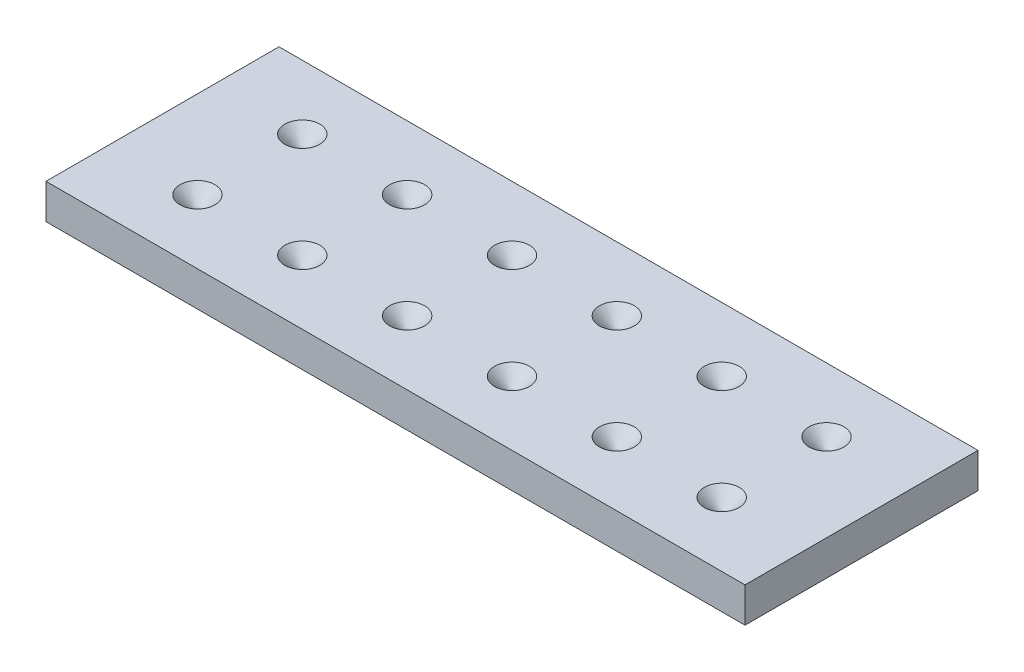
ISO-10303-21;
HEADER;
FILE_DESCRIPTION(('STEP AP214'),'2;1');
FILE_NAME('part.step','',(''),(''),'','','');
FILE_SCHEMA(('AUTOMOTIVE_DESIGN { 1 0 10303 214 1 1 1 1 }'));
ENDSEC;
DATA;
#1=APPLICATION_CONTEXT('core data for automotive mechanical design processes');
#2=APPLICATION_PROTOCOL_DEFINITION('international standard','automotive_design',2000,#1);
#3=PRODUCT_CONTEXT('',#1,'mechanical');
#4=PRODUCT('Part','Part','',(#3));
#5=PRODUCT_RELATED_PRODUCT_CATEGORY('part','',(#4));
#6=PRODUCT_DEFINITION_FORMATION('','',#4);
#7=PRODUCT_DEFINITION_CONTEXT('part definition',#1,'design');
#8=PRODUCT_DEFINITION('design','',#6,#7);
#9=PRODUCT_DEFINITION_SHAPE('','',#8);
#10=(LENGTH_UNIT() NAMED_UNIT(*) SI_UNIT(.MILLI.,.METRE.));
#11=(NAMED_UNIT(*) PLANE_ANGLE_UNIT() SI_UNIT($,.RADIAN.));
#12=(NAMED_UNIT(*) SI_UNIT($,.STERADIAN.) SOLID_ANGLE_UNIT());
#13=UNCERTAINTY_MEASURE_WITH_UNIT(LENGTH_MEASURE(1.E-05),#10,'distance_accuracy_value','');
#14=(GEOMETRIC_REPRESENTATION_CONTEXT(3) GLOBAL_UNCERTAINTY_ASSIGNED_CONTEXT((#13)) GLOBAL_UNIT_ASSIGNED_CONTEXT((#10,
#11,#12)) REPRESENTATION_CONTEXT('',''));
#15=CARTESIAN_POINT('',(0.,0.,0.));
#16=DIRECTION('',(0.,0.,1.));
#17=DIRECTION('',(1.,0.,0.));
#18=AXIS2_PLACEMENT_3D('',#15,#16,#17);
#19=CARTESIAN_POINT('',(22.5,3.,-4.5));
#20=DIRECTION('',(0.,1.,0.));
#21=DIRECTION('',(0.,0.,1.));
#22=AXIS2_PLACEMENT_3D('',#19,#20,#21);
#23=CONICAL_SURFACE('',#22,1.5,0.78539816339745);
#24=CARTESIAN_POINT('',(22.5,1.5,-4.5));
#25=VERTEX_POINT('',#24);
#26=VERTEX_LOOP('',#25);
#27=FACE_BOUND('',#26,.T.);
#28=CARTESIAN_POINT('',(22.5,3.,-4.5));
#29=DIRECTION('',(0.,1.,0.));
#30=DIRECTION('',(0.,0.,1.));
#31=AXIS2_PLACEMENT_3D('',#28,#29,#30);
#32=CIRCLE('',#31,1.5);
#33=CARTESIAN_POINT('',(22.5,3.,-2.99999999999999));
#34=VERTEX_POINT('',#33);
#35=EDGE_CURVE('E11',#34,#34,#32,.T.);
#36=ORIENTED_EDGE('',*,*,#35,.T.);
#37=EDGE_LOOP('',(#36));
#38=FACE_BOUND('',#37,.T.);
#39=ADVANCED_FACE('F39',(#27,#38),#23,.F.);
#40=CARTESIAN_POINT('',(13.5,3.,-4.5));
#41=DIRECTION('',(0.,1.,0.));
#42=DIRECTION('',(0.,0.,1.));
#43=AXIS2_PLACEMENT_3D('',#40,#41,#42);
#44=CONICAL_SURFACE('',#43,1.5,0.78539816339745);
#45=CARTESIAN_POINT('',(13.5,1.5,-4.5));
#46=VERTEX_POINT('',#45);
#47=VERTEX_LOOP('',#46);
#48=FACE_BOUND('',#47,.T.);
#49=CARTESIAN_POINT('',(13.5,3.,-4.5));
#50=DIRECTION('',(0.,1.,0.));
#51=DIRECTION('',(0.,0.,1.));
#52=AXIS2_PLACEMENT_3D('',#49,#50,#51);
#53=CIRCLE('',#52,1.5);
#54=CARTESIAN_POINT('',(13.5,3.,-2.99999999999999));
#55=VERTEX_POINT('',#54);
#56=EDGE_CURVE('E47',#55,#55,#53,.T.);
#57=ORIENTED_EDGE('',*,*,#56,.T.);
#58=EDGE_LOOP('',(#57));
#59=FACE_BOUND('',#58,.T.);
#60=ADVANCED_FACE('F201',(#48,#59),#44,.F.);
#61=CARTESIAN_POINT('',(4.5,3.,-4.5));
#62=DIRECTION('',(0.,1.,0.));
#63=DIRECTION('',(0.,0.,1.));
#64=AXIS2_PLACEMENT_3D('',#61,#62,#63);
#65=CONICAL_SURFACE('',#64,1.5,0.78539816339745);
#66=CARTESIAN_POINT('',(4.5,1.5,-4.5));
#67=VERTEX_POINT('',#66);
#68=VERTEX_LOOP('',#67);
#69=FACE_BOUND('',#68,.T.);
#70=CARTESIAN_POINT('',(4.5,3.,-4.5));
#71=DIRECTION('',(0.,1.,0.));
#72=DIRECTION('',(0.,0.,1.));
#73=AXIS2_PLACEMENT_3D('',#70,#71,#72);
#74=CIRCLE('',#73,1.5);
#75=CARTESIAN_POINT('',(4.5,3.,-2.99999999999999));
#76=VERTEX_POINT('',#75);
#77=EDGE_CURVE('E194',#76,#76,#74,.T.);
#78=ORIENTED_EDGE('',*,*,#77,.T.);
#79=EDGE_LOOP('',(#78));
#80=FACE_BOUND('',#79,.T.);
#81=ADVANCED_FACE('F215',(#69,#80),#65,.F.);
#82=CARTESIAN_POINT('',(-4.49999999999999,3.,-4.5));
#83=DIRECTION('',(0.,1.,0.));
#84=DIRECTION('',(0.,0.,1.));
#85=AXIS2_PLACEMENT_3D('',#82,#83,#84);
#86=CONICAL_SURFACE('',#85,1.5,0.78539816339745);
#87=CARTESIAN_POINT('',(-4.49999999999999,1.5,-4.5));
#88=VERTEX_POINT('',#87);
#89=VERTEX_LOOP('',#88);
#90=FACE_BOUND('',#89,.T.);
#91=CARTESIAN_POINT('',(-4.49999999999999,3.,-4.5));
#92=DIRECTION('',(0.,1.,0.));
#93=DIRECTION('',(0.,0.,1.));
#94=AXIS2_PLACEMENT_3D('',#91,#92,#93);
#95=CIRCLE('',#94,1.5);
#96=CARTESIAN_POINT('',(-4.49999999999999,3.,-2.99999999999999));
#97=VERTEX_POINT('',#96);
#98=EDGE_CURVE('E190',#97,#97,#95,.T.);
#99=ORIENTED_EDGE('',*,*,#98,.T.);
#100=EDGE_LOOP('',(#99));
#101=FACE_BOUND('',#100,.T.);
#102=ADVANCED_FACE('F219',(#90,#101),#86,.F.);
#103=CARTESIAN_POINT('',(-13.5,3.,-4.5));
#104=DIRECTION('',(0.,1.,0.));
#105=DIRECTION('',(0.,0.,1.));
#106=AXIS2_PLACEMENT_3D('',#103,#104,#105);
#107=CONICAL_SURFACE('',#106,1.5,0.78539816339745);
#108=CARTESIAN_POINT('',(-13.5,1.5,-4.5));
#109=VERTEX_POINT('',#108);
#110=VERTEX_LOOP('',#109);
#111=FACE_BOUND('',#110,.T.);
#112=CARTESIAN_POINT('',(-13.5,3.,-4.5));
#113=DIRECTION('',(0.,1.,0.));
#114=DIRECTION('',(0.,0.,1.));
#115=AXIS2_PLACEMENT_3D('',#112,#113,#114);
#116=CIRCLE('',#115,1.5);
#117=CARTESIAN_POINT('',(-13.5,3.,-2.99999999999999));
#118=VERTEX_POINT('',#117);
#119=EDGE_CURVE('E186',#118,#118,#116,.T.);
#120=ORIENTED_EDGE('',*,*,#119,.T.);
#121=EDGE_LOOP('',(#120));
#122=FACE_BOUND('',#121,.T.);
#123=ADVANCED_FACE('F225',(#111,#122),#107,.F.);
#124=CARTESIAN_POINT('',(-22.5,3.,-4.5));
#125=DIRECTION('',(0.,1.,0.));
#126=DIRECTION('',(0.,0.,1.));
#127=AXIS2_PLACEMENT_3D('',#124,#125,#126);
#128=CONICAL_SURFACE('',#127,1.5,0.78539816339745);
#129=CARTESIAN_POINT('',(-22.5,1.5,-4.5));
#130=VERTEX_POINT('',#129);
#131=VERTEX_LOOP('',#130);
#132=FACE_BOUND('',#131,.T.);
#133=CARTESIAN_POINT('',(-22.5,3.,-4.5));
#134=DIRECTION('',(0.,1.,0.));
#135=DIRECTION('',(0.,0.,1.));
#136=AXIS2_PLACEMENT_3D('',#133,#134,#135);
#137=CIRCLE('',#136,1.5);
#138=CARTESIAN_POINT('',(-22.5,3.,-2.99999999999999));
#139=VERTEX_POINT('',#138);
#140=EDGE_CURVE('E182',#139,#139,#137,.T.);
#141=ORIENTED_EDGE('',*,*,#140,.T.);
#142=EDGE_LOOP('',(#141));
#143=FACE_BOUND('',#142,.T.);
#144=ADVANCED_FACE('F229',(#132,#143),#128,.F.);
#145=CARTESIAN_POINT('',(22.5,3.,4.5));
#146=DIRECTION('',(0.,1.,0.));
#147=DIRECTION('',(0.,0.,1.));
#148=AXIS2_PLACEMENT_3D('',#145,#146,#147);
#149=CONICAL_SURFACE('',#148,1.5,0.78539816339745);
#150=CARTESIAN_POINT('',(22.5,1.5,4.5));
#151=VERTEX_POINT('',#150);
#152=VERTEX_LOOP('',#151);
#153=FACE_BOUND('',#152,.T.);
#154=CARTESIAN_POINT('',(22.5,3.,4.5));
#155=DIRECTION('',(0.,1.,0.));
#156=DIRECTION('',(0.,0.,1.));
#157=AXIS2_PLACEMENT_3D('',#154,#155,#156);
#158=CIRCLE('',#157,1.5);
#159=CARTESIAN_POINT('',(22.5,3.,6.));
#160=VERTEX_POINT('',#159);
#161=EDGE_CURVE('E178',#160,#160,#158,.T.);
#162=ORIENTED_EDGE('',*,*,#161,.T.);
#163=EDGE_LOOP('',(#162));
#164=FACE_BOUND('',#163,.T.);
#165=ADVANCED_FACE('F233',(#153,#164),#149,.F.);
#166=CARTESIAN_POINT('',(13.5,3.,4.5));
#167=DIRECTION('',(0.,1.,0.));
#168=DIRECTION('',(0.,0.,1.));
#169=AXIS2_PLACEMENT_3D('',#166,#167,#168);
#170=CONICAL_SURFACE('',#169,1.5,0.78539816339745);
#171=CARTESIAN_POINT('',(13.5,1.5,4.5));
#172=VERTEX_POINT('',#171);
#173=VERTEX_LOOP('',#172);
#174=FACE_BOUND('',#173,.T.);
#175=CARTESIAN_POINT('',(13.5,3.,4.5));
#176=DIRECTION('',(0.,1.,0.));
#177=DIRECTION('',(0.,0.,1.));
#178=AXIS2_PLACEMENT_3D('',#175,#176,#177);
#179=CIRCLE('',#178,1.5);
#180=CARTESIAN_POINT('',(13.5,3.,6.));
#181=VERTEX_POINT('',#180);
#182=EDGE_CURVE('E174',#181,#181,#179,.T.);
#183=ORIENTED_EDGE('',*,*,#182,.T.);
#184=EDGE_LOOP('',(#183));
#185=FACE_BOUND('',#184,.T.);
#186=ADVANCED_FACE('F237',(#174,#185),#170,.F.);
#187=CARTESIAN_POINT('',(4.5,3.,4.5));
#188=DIRECTION('',(0.,1.,0.));
#189=DIRECTION('',(0.,0.,1.));
#190=AXIS2_PLACEMENT_3D('',#187,#188,#189);
#191=CONICAL_SURFACE('',#190,1.5,0.78539816339745);
#192=CARTESIAN_POINT('',(4.5,1.5,4.5));
#193=VERTEX_POINT('',#192);
#194=VERTEX_LOOP('',#193);
#195=FACE_BOUND('',#194,.T.);
#196=CARTESIAN_POINT('',(4.5,3.,4.5));
#197=DIRECTION('',(0.,1.,0.));
#198=DIRECTION('',(0.,0.,1.));
#199=AXIS2_PLACEMENT_3D('',#196,#197,#198);
#200=CIRCLE('',#199,1.5);
#201=CARTESIAN_POINT('',(4.5,3.,6.));
#202=VERTEX_POINT('',#201);
#203=EDGE_CURVE('E170',#202,#202,#200,.T.);
#204=ORIENTED_EDGE('',*,*,#203,.T.);
#205=EDGE_LOOP('',(#204));
#206=FACE_BOUND('',#205,.T.);
#207=ADVANCED_FACE('F241',(#195,#206),#191,.F.);
#208=CARTESIAN_POINT('',(-4.49999999999999,3.,4.5));
#209=DIRECTION('',(0.,1.,0.));
#210=DIRECTION('',(0.,0.,1.));
#211=AXIS2_PLACEMENT_3D('',#208,#209,#210);
#212=CONICAL_SURFACE('',#211,1.5,0.78539816339745);
#213=CARTESIAN_POINT('',(-4.49999999999999,1.5,4.5));
#214=VERTEX_POINT('',#213);
#215=VERTEX_LOOP('',#214);
#216=FACE_BOUND('',#215,.T.);
#217=CARTESIAN_POINT('',(-4.49999999999999,3.,4.5));
#218=DIRECTION('',(0.,1.,0.));
#219=DIRECTION('',(0.,0.,1.));
#220=AXIS2_PLACEMENT_3D('',#217,#218,#219);
#221=CIRCLE('',#220,1.5);
#222=CARTESIAN_POINT('',(-4.49999999999999,3.,6.));
#223=VERTEX_POINT('',#222);
#224=EDGE_CURVE('E166',#223,#223,#221,.T.);
#225=ORIENTED_EDGE('',*,*,#224,.T.);
#226=EDGE_LOOP('',(#225));
#227=FACE_BOUND('',#226,.T.);
#228=ADVANCED_FACE('F245',(#216,#227),#212,.F.);
#229=CARTESIAN_POINT('',(30.,3.,-9.99999999999999));
#230=DIRECTION('',(-1.,0.,0.));
#231=DIRECTION('',(0.,0.,1.));
#232=AXIS2_PLACEMENT_3D('',#229,#230,#231);
#233=PLANE('',#232);
#234=DIRECTION('',(0.,0.,-1.));
#235=VECTOR('',#234,1.);
#236=CARTESIAN_POINT('',(30.,0.,-9.99999999999999));
#237=LINE('',#236,#235);
#238=CARTESIAN_POINT('',(30.,0.,10.));
#239=VERTEX_POINT('',#238);
#240=CARTESIAN_POINT('',(30.,0.,-9.99999999999999));
#241=VERTEX_POINT('',#240);
#242=EDGE_CURVE('E122',#239,#241,#237,.T.);
#243=ORIENTED_EDGE('',*,*,#242,.T.);
#244=DIRECTION('',(0.,-1.,0.));
#245=VECTOR('',#244,1.);
#246=CARTESIAN_POINT('',(30.,3.,-9.99999999999999));
#247=LINE('',#246,#245);
#248=CARTESIAN_POINT('',(30.,3.,-9.99999999999999));
#249=VERTEX_POINT('',#248);
#250=EDGE_CURVE('E162',#249,#241,#247,.T.);
#251=ORIENTED_EDGE('',*,*,#250,.F.);
#252=DIRECTION('',(0.,0.,-1.));
#253=VECTOR('',#252,1.);
#254=CARTESIAN_POINT('',(30.,3.,-9.99999999999999));
#255=LINE('',#254,#253);
#256=CARTESIAN_POINT('',(30.,3.,10.));
#257=VERTEX_POINT('',#256);
#258=EDGE_CURVE('E125',#257,#249,#255,.T.);
#259=ORIENTED_EDGE('',*,*,#258,.F.);
#260=DIRECTION('',(0.,-1.,0.));
#261=VECTOR('',#260,1.);
#262=CARTESIAN_POINT('',(30.,3.,10.));
#263=LINE('',#262,#261);
#264=EDGE_CURVE('E139',#257,#239,#263,.T.);
#265=ORIENTED_EDGE('',*,*,#264,.T.);
#266=EDGE_LOOP('',(#243,#251,#259,#265));
#267=FACE_BOUND('',#266,.T.);
#268=ADVANCED_FACE('F249',(#267),#233,.F.);
#269=CARTESIAN_POINT('',(-30.,3.,-9.99999999999999));
#270=DIRECTION('',(0.,0.,1.));
#271=DIRECTION('',(1.,0.,0.));
#272=AXIS2_PLACEMENT_3D('',#269,#270,#271);
#273=PLANE('',#272);
#274=DIRECTION('',(-1.,0.,0.));
#275=VECTOR('',#274,1.);
#276=CARTESIAN_POINT('',(-30.,0.,-9.99999999999999));
#277=LINE('',#276,#275);
#278=CARTESIAN_POINT('',(-30.,0.,-9.99999999999999));
#279=VERTEX_POINT('',#278);
#280=EDGE_CURVE('E143',#241,#279,#277,.T.);
#281=ORIENTED_EDGE('',*,*,#280,.T.);
#282=DIRECTION('',(0.,-1.,0.));
#283=VECTOR('',#282,1.);
#284=CARTESIAN_POINT('',(-30.,3.,-9.99999999999999));
#285=LINE('',#284,#283);
#286=CARTESIAN_POINT('',(-30.,3.,-9.99999999999999));
#287=VERTEX_POINT('',#286);
#288=EDGE_CURVE('E158',#287,#279,#285,.T.);
#289=ORIENTED_EDGE('',*,*,#288,.F.);
#290=DIRECTION('',(-1.,0.,0.));
#291=VECTOR('',#290,1.);
#292=CARTESIAN_POINT('',(-30.,3.,-9.99999999999999));
#293=LINE('',#292,#291);
#294=EDGE_CURVE('E129',#249,#287,#293,.T.);
#295=ORIENTED_EDGE('',*,*,#294,.F.);
#296=ORIENTED_EDGE('',*,*,#250,.T.);
#297=EDGE_LOOP('',(#281,#289,#295,#296));
#298=FACE_BOUND('',#297,.T.);
#299=ADVANCED_FACE('F253',(#298),#273,.F.);
#300=CARTESIAN_POINT('',(-30.,3.,-9.99999999999999));
#301=DIRECTION('',(1.,0.,0.));
#302=DIRECTION('',(0.,0.,-1.));
#303=AXIS2_PLACEMENT_3D('',#300,#301,#302);
#304=PLANE('',#303);
#305=DIRECTION('',(0.,0.,1.));
#306=VECTOR('',#305,1.);
#307=CARTESIAN_POINT('',(-30.,0.,-9.99999999999999));
#308=LINE('',#307,#306);
#309=CARTESIAN_POINT('',(-30.,0.,10.));
#310=VERTEX_POINT('',#309);
#311=EDGE_CURVE('E146',#279,#310,#308,.T.);
#312=ORIENTED_EDGE('',*,*,#311,.T.);
#313=DIRECTION('',(0.,-1.,0.));
#314=VECTOR('',#313,1.);
#315=CARTESIAN_POINT('',(-30.,3.,10.));
#316=LINE('',#315,#314);
#317=CARTESIAN_POINT('',(-30.,3.,10.));
#318=VERTEX_POINT('',#317);
#319=EDGE_CURVE('E154',#318,#310,#316,.T.);
#320=ORIENTED_EDGE('',*,*,#319,.F.);
#321=DIRECTION('',(0.,0.,1.));
#322=VECTOR('',#321,1.);
#323=CARTESIAN_POINT('',(-30.,3.,-9.99999999999999));
#324=LINE('',#323,#322);
#325=EDGE_CURVE('E133',#287,#318,#324,.T.);
#326=ORIENTED_EDGE('',*,*,#325,.F.);
#327=ORIENTED_EDGE('',*,*,#288,.T.);
#328=EDGE_LOOP('',(#312,#320,#326,#327));
#329=FACE_BOUND('',#328,.T.);
#330=ADVANCED_FACE('F257',(#329),#304,.F.);
#331=CARTESIAN_POINT('',(-30.,3.,10.));
#332=DIRECTION('',(0.,0.,-1.));
#333=DIRECTION('',(-1.,0.,0.));
#334=AXIS2_PLACEMENT_3D('',#331,#332,#333);
#335=PLANE('',#334);
#336=DIRECTION('',(1.,0.,0.));
#337=VECTOR('',#336,1.);
#338=CARTESIAN_POINT('',(-30.,0.,10.));
#339=LINE('',#338,#337);
#340=EDGE_CURVE('E130',#310,#239,#339,.T.);
#341=ORIENTED_EDGE('',*,*,#340,.T.);
#342=ORIENTED_EDGE('',*,*,#264,.F.);
#343=DIRECTION('',(1.,0.,0.));
#344=VECTOR('',#343,1.);
#345=CARTESIAN_POINT('',(-30.,3.,10.));
#346=LINE('',#345,#344);
#347=EDGE_CURVE('E136',#318,#257,#346,.T.);
#348=ORIENTED_EDGE('',*,*,#347,.F.);
#349=ORIENTED_EDGE('',*,*,#319,.T.);
#350=EDGE_LOOP('',(#341,#342,#348,#349));
#351=FACE_BOUND('',#350,.T.);
#352=ADVANCED_FACE('F207',(#351),#335,.F.);
#353=CARTESIAN_POINT('',(0.,3.,0.));
#354=DIRECTION('',(0.,1.,0.));
#355=DIRECTION('',(0.,0.,1.));
#356=AXIS2_PLACEMENT_3D('',#353,#354,#355);
#357=PLANE('',#356);
#358=CARTESIAN_POINT('',(-13.5,3.,4.5));
#359=DIRECTION('',(0.,1.,0.));
#360=DIRECTION('',(0.,0.,1.));
#361=AXIS2_PLACEMENT_3D('',#358,#359,#360);
#362=CIRCLE('',#361,1.5);
#363=CARTESIAN_POINT('',(-13.5,3.,6.));
#364=VERTEX_POINT('',#363);
#365=EDGE_CURVE('E115',#364,#364,#362,.T.);
#366=ORIENTED_EDGE('',*,*,#365,.F.);
#367=EDGE_LOOP('',(#366));
#368=FACE_BOUND('',#367,.T.);
#369=CARTESIAN_POINT('',(-22.5,3.,4.5));
#370=DIRECTION('',(0.,1.,0.));
#371=DIRECTION('',(0.,0.,1.));
#372=AXIS2_PLACEMENT_3D('',#369,#370,#371);
#373=CIRCLE('',#372,1.5);
#374=CARTESIAN_POINT('',(-22.5,3.,6.));
#375=VERTEX_POINT('',#374);
#376=EDGE_CURVE('E118',#375,#375,#373,.T.);
#377=ORIENTED_EDGE('',*,*,#376,.F.);
#378=EDGE_LOOP('',(#377));
#379=FACE_BOUND('',#378,.T.);
#380=ORIENTED_EDGE('',*,*,#258,.T.);
#381=ORIENTED_EDGE('',*,*,#294,.T.);
#382=ORIENTED_EDGE('',*,*,#325,.T.);
#383=ORIENTED_EDGE('',*,*,#347,.T.);
#384=EDGE_LOOP('',(#380,#381,#382,#383));
#385=FACE_BOUND('',#384,.T.);
#386=ORIENTED_EDGE('',*,*,#224,.F.);
#387=EDGE_LOOP('',(#386));
#388=FACE_BOUND('',#387,.T.);
#389=ORIENTED_EDGE('',*,*,#203,.F.);
#390=EDGE_LOOP('',(#389));
#391=FACE_BOUND('',#390,.T.);
#392=ORIENTED_EDGE('',*,*,#182,.F.);
#393=EDGE_LOOP('',(#392));
#394=FACE_BOUND('',#393,.T.);
#395=ORIENTED_EDGE('',*,*,#161,.F.);
#396=EDGE_LOOP('',(#395));
#397=FACE_BOUND('',#396,.T.);
#398=ORIENTED_EDGE('',*,*,#140,.F.);
#399=EDGE_LOOP('',(#398));
#400=FACE_BOUND('',#399,.T.);
#401=ORIENTED_EDGE('',*,*,#119,.F.);
#402=EDGE_LOOP('',(#401));
#403=FACE_BOUND('',#402,.T.);
#404=ORIENTED_EDGE('',*,*,#98,.F.);
#405=EDGE_LOOP('',(#404));
#406=FACE_BOUND('',#405,.T.);
#407=ORIENTED_EDGE('',*,*,#77,.F.);
#408=EDGE_LOOP('',(#407));
#409=FACE_BOUND('',#408,.T.);
#410=ORIENTED_EDGE('',*,*,#56,.F.);
#411=EDGE_LOOP('',(#410));
#412=FACE_BOUND('',#411,.T.);
#413=ORIENTED_EDGE('',*,*,#35,.F.);
#414=EDGE_LOOP('',(#413));
#415=FACE_BOUND('',#414,.T.);
#416=ADVANCED_FACE('F203',(#368,#379,#385,#388,#391,#394,#397,#400,#403,#406,#409,#412,#415),
#357,.T.);
#417=CARTESIAN_POINT('',(0.,0.,0.));
#418=DIRECTION('',(0.,1.,0.));
#419=DIRECTION('',(0.,0.,1.));
#420=AXIS2_PLACEMENT_3D('',#417,#418,#419);
#421=PLANE('',#420);
#422=ORIENTED_EDGE('',*,*,#242,.F.);
#423=ORIENTED_EDGE('',*,*,#340,.F.);
#424=ORIENTED_EDGE('',*,*,#311,.F.);
#425=ORIENTED_EDGE('',*,*,#280,.F.);
#426=EDGE_LOOP('',(#422,#423,#424,#425));
#427=FACE_BOUND('',#426,.T.);
#428=ADVANCED_FACE('F206',(#427),#421,.F.);
#429=CARTESIAN_POINT('',(-22.5,3.,4.5));
#430=DIRECTION('',(0.,1.,0.));
#431=DIRECTION('',(0.,0.,1.));
#432=AXIS2_PLACEMENT_3D('',#429,#430,#431);
#433=CONICAL_SURFACE('',#432,1.5,0.78539816339745);
#434=CARTESIAN_POINT('',(-22.5,1.5,4.5));
#435=VERTEX_POINT('',#434);
#436=VERTEX_LOOP('',#435);
#437=FACE_BOUND('',#436,.T.);
#438=ORIENTED_EDGE('',*,*,#376,.T.);
#439=EDGE_LOOP('',(#438));
#440=FACE_BOUND('',#439,.T.);
#441=ADVANCED_FACE('F111',(#437,#440),#433,.F.);
#442=CARTESIAN_POINT('',(-13.5,3.,4.5));
#443=DIRECTION('',(0.,1.,0.));
#444=DIRECTION('',(0.,0.,1.));
#445=AXIS2_PLACEMENT_3D('',#442,#443,#444);
#446=CONICAL_SURFACE('',#445,1.5,0.78539816339745);
#447=CARTESIAN_POINT('',(-13.5,1.5,4.5));
#448=VERTEX_POINT('',#447);
#449=VERTEX_LOOP('',#448);
#450=FACE_BOUND('',#449,.T.);
#451=ORIENTED_EDGE('',*,*,#365,.T.);
#452=EDGE_LOOP('',(#451));
#453=FACE_BOUND('',#452,.T.);
#454=ADVANCED_FACE('F108',(#450,#453),#446,.F.);
#455=CLOSED_SHELL('',(#39,#60,#81,#102,#123,#144,#165,#186,#207,#228,#268,#299,#330,#352,#416,
#428,#441,#454));
#456=MANIFOLD_SOLID_BREP('B2',#455);
#457=ADVANCED_BREP_SHAPE_REPRESENTATION('',(#18,#456),#14);
#458=SHAPE_DEFINITION_REPRESENTATION(#9,#457);
ENDSEC;
END-ISO-10303-21;
